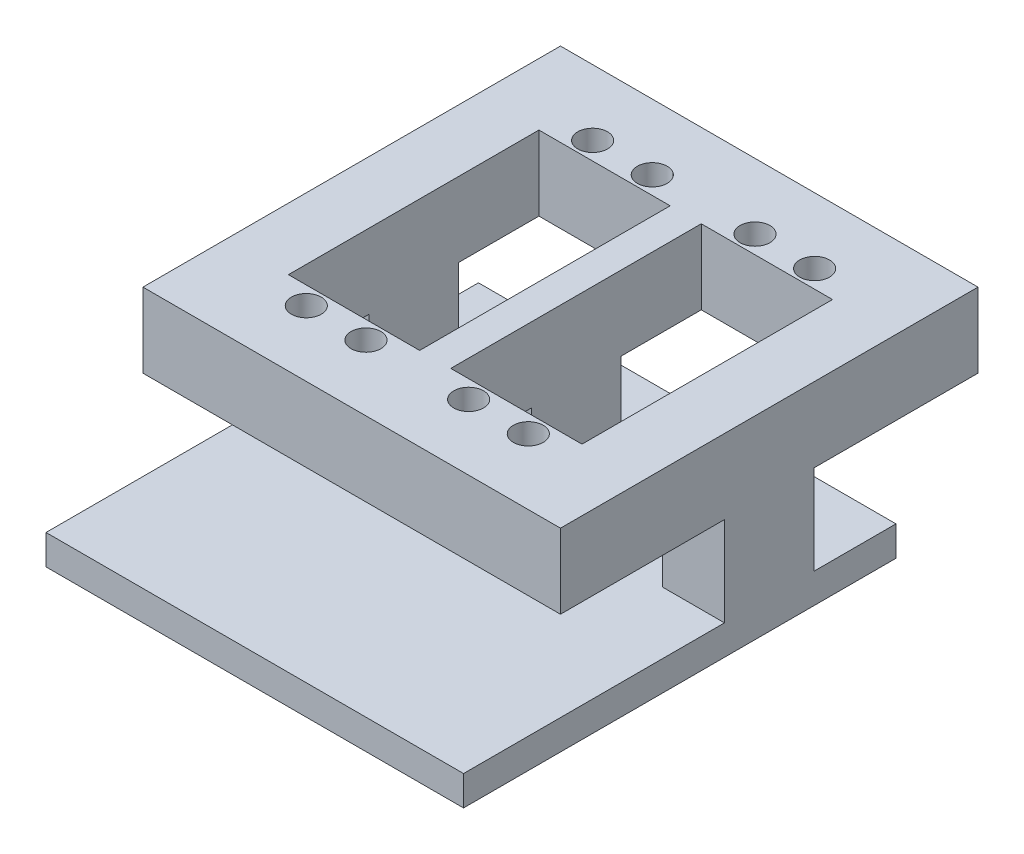
ISO-10303-21;
HEADER;
FILE_DESCRIPTION(('STEP AP214'),'2;1');
FILE_NAME('part.step','',(''),(''),'','','');
FILE_SCHEMA(('AUTOMOTIVE_DESIGN { 1 0 10303 214 1 1 1 1 }'));
ENDSEC;
DATA;
#1=APPLICATION_CONTEXT('core data for automotive mechanical design processes');
#2=APPLICATION_PROTOCOL_DEFINITION('international standard','automotive_design',2000,#1);
#3=PRODUCT_CONTEXT('',#1,'mechanical');
#4=PRODUCT('Part','Part','',(#3));
#5=PRODUCT_RELATED_PRODUCT_CATEGORY('part','',(#4));
#6=PRODUCT_DEFINITION_FORMATION('','',#4);
#7=PRODUCT_DEFINITION_CONTEXT('part definition',#1,'design');
#8=PRODUCT_DEFINITION('design','',#6,#7);
#9=PRODUCT_DEFINITION_SHAPE('','',#8);
#10=(LENGTH_UNIT() NAMED_UNIT(*) SI_UNIT(.MILLI.,.METRE.));
#11=(NAMED_UNIT(*) PLANE_ANGLE_UNIT() SI_UNIT($,.RADIAN.));
#12=(NAMED_UNIT(*) SI_UNIT($,.STERADIAN.) SOLID_ANGLE_UNIT());
#13=UNCERTAINTY_MEASURE_WITH_UNIT(LENGTH_MEASURE(1.E-05),#10,'distance_accuracy_value','');
#14=(GEOMETRIC_REPRESENTATION_CONTEXT(3) GLOBAL_UNCERTAINTY_ASSIGNED_CONTEXT((#13)) GLOBAL_UNIT_ASSIGNED_CONTEXT((#10,
#11,#12)) REPRESENTATION_CONTEXT('',''));
#15=CARTESIAN_POINT('',(0.,0.,0.));
#16=DIRECTION('',(0.,0.,1.));
#17=DIRECTION('',(1.,0.,0.));
#18=AXIS2_PLACEMENT_3D('',#15,#16,#17);
#19=CARTESIAN_POINT('',(0.,0.,0.));
#20=DIRECTION('',(0.,1.,0.));
#21=DIRECTION('',(0.,0.,1.));
#22=AXIS2_PLACEMENT_3D('',#19,#20,#21);
#23=PLANE('',#22);
#24=CARTESIAN_POINT('',(18.6085009651864,0.,-24.));
#25=DIRECTION('',(0.,1.,0.));
#26=DIRECTION('',(0.,0.,-1.));
#27=AXIS2_PLACEMENT_3D('',#24,#25,#26);
#28=CIRCLE('',#27,2.5);
#29=CARTESIAN_POINT('',(18.6085009651864,0.,-26.5));
#30=VERTEX_POINT('',#29);
#31=EDGE_CURVE('E439',#30,#30,#28,.T.);
#32=ORIENTED_EDGE('',*,*,#31,.T.);
#33=EDGE_LOOP('',(#32));
#34=FACE_BOUND('',#33,.T.);
#35=CARTESIAN_POINT('',(8.60850096518641,0.,-24.));
#36=DIRECTION('',(0.,1.,0.));
#37=DIRECTION('',(0.,0.,-1.));
#38=AXIS2_PLACEMENT_3D('',#35,#36,#37);
#39=CIRCLE('',#38,2.5);
#40=CARTESIAN_POINT('',(8.60850096518641,0.,-26.5));
#41=VERTEX_POINT('',#40);
#42=EDGE_CURVE('E444',#41,#41,#39,.T.);
#43=ORIENTED_EDGE('',*,*,#42,.T.);
#44=EDGE_LOOP('',(#43));
#45=FACE_BOUND('',#44,.T.);
#46=CARTESIAN_POINT('',(-8.60850096518641,0.,-24.));
#47=DIRECTION('',(0.,1.,0.));
#48=DIRECTION('',(0.,0.,1.));
#49=AXIS2_PLACEMENT_3D('',#46,#47,#48);
#50=CIRCLE('',#49,2.5);
#51=CARTESIAN_POINT('',(-8.60850096518641,0.,-21.5));
#52=VERTEX_POINT('',#51);
#53=EDGE_CURVE('E484',#52,#52,#50,.T.);
#54=ORIENTED_EDGE('',*,*,#53,.T.);
#55=EDGE_LOOP('',(#54));
#56=FACE_BOUND('',#55,.T.);
#57=CARTESIAN_POINT('',(-18.6085009651864,0.,-24.));
#58=DIRECTION('',(0.,1.,0.));
#59=DIRECTION('',(0.,0.,1.));
#60=AXIS2_PLACEMENT_3D('',#57,#58,#59);
#61=CIRCLE('',#60,2.5);
#62=CARTESIAN_POINT('',(-18.6085009651864,0.,-21.5));
#63=VERTEX_POINT('',#62);
#64=EDGE_CURVE('E492',#63,#63,#61,.T.);
#65=ORIENTED_EDGE('',*,*,#64,.T.);
#66=EDGE_LOOP('',(#65));
#67=FACE_BOUND('',#66,.T.);
#68=DIRECTION('',(1.,0.,0.));
#69=VECTOR('',#68,1.);
#70=CARTESIAN_POINT('',(24.6085009651864,0.,-7.50000000000028));
#71=LINE('',#70,#69);
#72=CARTESIAN_POINT('',(24.6085009651864,0.,-7.50000000000028));
#73=VERTEX_POINT('',#72);
#74=CARTESIAN_POINT('',(35.,0.,-7.50000000000028));
#75=VERTEX_POINT('',#74);
#76=EDGE_CURVE('E309',#73,#75,#71,.T.);
#77=ORIENTED_EDGE('',*,*,#76,.F.);
#78=DIRECTION('',(0.,0.,-1.));
#79=VECTOR('',#78,1.);
#80=CARTESIAN_POINT('',(24.6085009651864,0.,-21.));
#81=LINE('',#80,#79);
#82=CARTESIAN_POINT('',(24.6085009651864,0.,-21.));
#83=VERTEX_POINT('',#82);
#84=EDGE_CURVE('E395',#73,#83,#81,.T.);
#85=ORIENTED_EDGE('',*,*,#84,.T.);
#86=DIRECTION('',(-1.,0.,0.));
#87=VECTOR('',#86,1.);
#88=CARTESIAN_POINT('',(24.6085009651864,0.,-21.));
#89=LINE('',#88,#87);
#90=CARTESIAN_POINT('',(2.60850096518642,0.,-21.));
#91=VERTEX_POINT('',#90);
#92=EDGE_CURVE('E414',#83,#91,#89,.T.);
#93=ORIENTED_EDGE('',*,*,#92,.T.);
#94=DIRECTION('',(0.,0.,1.));
#95=VECTOR('',#94,1.);
#96=CARTESIAN_POINT('',(2.60850096518642,0.,-21.));
#97=LINE('',#96,#95);
#98=CARTESIAN_POINT('',(2.60850096518642,0.,-7.50000000000016));
#99=VERTEX_POINT('',#98);
#100=EDGE_CURVE('E419',#91,#99,#97,.T.);
#101=ORIENTED_EDGE('',*,*,#100,.T.);
#102=DIRECTION('',(1.,0.,0.));
#103=VECTOR('',#102,1.);
#104=CARTESIAN_POINT('',(-2.6085009651864,0.,-7.50000000000016));
#105=LINE('',#104,#103);
#106=CARTESIAN_POINT('',(-2.60850096518641,0.,-7.50000000000016));
#107=VERTEX_POINT('',#106);
#108=EDGE_CURVE('E345',#107,#99,#105,.T.);
#109=ORIENTED_EDGE('',*,*,#108,.F.);
#110=DIRECTION('',(0.,0.,-1.));
#111=VECTOR('',#110,1.);
#112=CARTESIAN_POINT('',(-2.60850096518641,0.,-21.));
#113=LINE('',#112,#111);
#114=CARTESIAN_POINT('',(-2.60850096518641,0.,-21.));
#115=VERTEX_POINT('',#114);
#116=EDGE_CURVE('E500',#107,#115,#113,.T.);
#117=ORIENTED_EDGE('',*,*,#116,.T.);
#118=DIRECTION('',(-1.,0.,0.));
#119=VECTOR('',#118,1.);
#120=CARTESIAN_POINT('',(-24.6085009651864,0.,-21.));
#121=LINE('',#120,#119);
#122=CARTESIAN_POINT('',(-24.6085009651864,0.,-21.));
#123=VERTEX_POINT('',#122);
#124=EDGE_CURVE('E522',#115,#123,#121,.T.);
#125=ORIENTED_EDGE('',*,*,#124,.T.);
#126=DIRECTION('',(0.,0.,1.));
#127=VECTOR('',#126,1.);
#128=CARTESIAN_POINT('',(-24.6085009651864,0.,-21.));
#129=LINE('',#128,#127);
#130=CARTESIAN_POINT('',(-24.6085009651864,0.,-7.50000000000028));
#131=VERTEX_POINT('',#130);
#132=EDGE_CURVE('E527',#123,#131,#129,.T.);
#133=ORIENTED_EDGE('',*,*,#132,.T.);
#134=DIRECTION('',(1.,0.,0.));
#135=VECTOR('',#134,1.);
#136=CARTESIAN_POINT('',(-35.,0.,-7.50000000000001));
#137=LINE('',#136,#135);
#138=CARTESIAN_POINT('',(-35.,0.,-7.50000000000001));
#139=VERTEX_POINT('',#138);
#140=EDGE_CURVE('E350',#139,#131,#137,.T.);
#141=ORIENTED_EDGE('',*,*,#140,.F.);
#142=DIRECTION('',(0.,0.,1.));
#143=VECTOR('',#142,1.);
#144=CARTESIAN_POINT('',(-35.,0.,-35.));
#145=LINE('',#144,#143);
#146=CARTESIAN_POINT('',(-35.,0.,-35.));
#147=VERTEX_POINT('',#146);
#148=EDGE_CURVE('E570',#147,#139,#145,.T.);
#149=ORIENTED_EDGE('',*,*,#148,.F.);
#150=DIRECTION('',(-1.,0.,0.));
#151=VECTOR('',#150,1.);
#152=CARTESIAN_POINT('',(-35.,0.,-35.));
#153=LINE('',#152,#151);
#154=CARTESIAN_POINT('',(35.,0.,-35.));
#155=VERTEX_POINT('',#154);
#156=EDGE_CURVE('E566',#155,#147,#153,.T.);
#157=ORIENTED_EDGE('',*,*,#156,.F.);
#158=DIRECTION('',(0.,0.,-1.));
#159=VECTOR('',#158,1.);
#160=CARTESIAN_POINT('',(35.,0.,-35.));
#161=LINE('',#160,#159);
#162=EDGE_CURVE('E61',#75,#155,#161,.T.);
#163=ORIENTED_EDGE('',*,*,#162,.F.);
#164=EDGE_LOOP('',(#77,#85,#93,#101,#109,#117,#125,#133,#141,#149,#157,#163));
#165=FACE_BOUND('',#164,.T.);
#166=ADVANCED_FACE('F45',(#34,#45,#56,#67,#165),#23,.F.);
#167=CARTESIAN_POINT('',(18.6085009651864,0.,24.));
#168=DIRECTION('',(0.,1.,0.));
#169=DIRECTION('',(0.,0.,1.));
#170=AXIS2_PLACEMENT_3D('',#167,#168,#169);
#171=CIRCLE('',#170,2.5);
#172=CARTESIAN_POINT('',(18.6085009651864,0.,26.5));
#173=VERTEX_POINT('',#172);
#174=EDGE_CURVE('E452',#173,#173,#171,.T.);
#175=ORIENTED_EDGE('',*,*,#174,.T.);
#176=EDGE_LOOP('',(#175));
#177=FACE_BOUND('',#176,.T.);
#178=CARTESIAN_POINT('',(8.60850096518641,0.,24.));
#179=DIRECTION('',(0.,1.,0.));
#180=DIRECTION('',(0.,0.,1.));
#181=AXIS2_PLACEMENT_3D('',#178,#179,#180);
#182=CIRCLE('',#181,2.5);
#183=CARTESIAN_POINT('',(8.60850096518641,0.,26.5));
#184=VERTEX_POINT('',#183);
#185=EDGE_CURVE('E460',#184,#184,#182,.T.);
#186=ORIENTED_EDGE('',*,*,#185,.T.);
#187=EDGE_LOOP('',(#186));
#188=FACE_BOUND('',#187,.T.);
#189=CARTESIAN_POINT('',(-18.6085009651864,0.,24.));
#190=DIRECTION('',(0.,1.,0.));
#191=DIRECTION('',(0.,0.,-1.));
#192=AXIS2_PLACEMENT_3D('',#189,#190,#191);
#193=CIRCLE('',#192,2.5);
#194=CARTESIAN_POINT('',(-18.6085009651864,0.,21.5));
#195=VERTEX_POINT('',#194);
#196=EDGE_CURVE('E468',#195,#195,#193,.T.);
#197=ORIENTED_EDGE('',*,*,#196,.T.);
#198=EDGE_LOOP('',(#197));
#199=FACE_BOUND('',#198,.T.);
#200=CARTESIAN_POINT('',(-8.60850096518641,0.,24.));
#201=DIRECTION('',(0.,1.,0.));
#202=DIRECTION('',(0.,0.,-1.));
#203=AXIS2_PLACEMENT_3D('',#200,#201,#202);
#204=CIRCLE('',#203,2.5);
#205=CARTESIAN_POINT('',(-8.60850096518641,0.,21.5));
#206=VERTEX_POINT('',#205);
#207=EDGE_CURVE('E476',#206,#206,#204,.T.);
#208=ORIENTED_EDGE('',*,*,#207,.T.);
#209=EDGE_LOOP('',(#208));
#210=FACE_BOUND('',#209,.T.);
#211=CARTESIAN_POINT('',(24.6085009651864,0.,21.));
#212=VERTEX_POINT('',#211);
#213=CARTESIAN_POINT('',(24.6085009651864,0.,7.50000000000003));
#214=VERTEX_POINT('',#213);
#215=EDGE_CURVE('E411',#212,#214,#81,.T.);
#216=ORIENTED_EDGE('',*,*,#215,.T.);
#217=DIRECTION('',(1.,0.,0.));
#218=VECTOR('',#217,1.);
#219=CARTESIAN_POINT('',(24.6085009651864,0.,7.50000000000003));
#220=LINE('',#219,#218);
#221=CARTESIAN_POINT('',(35.,0.,7.50000000000003));
#222=VERTEX_POINT('',#221);
#223=EDGE_CURVE('E69',#214,#222,#220,.T.);
#224=ORIENTED_EDGE('',*,*,#223,.T.);
#225=CARTESIAN_POINT('',(35.,0.,35.));
#226=VERTEX_POINT('',#225);
#227=EDGE_CURVE('E563',#226,#222,#161,.T.);
#228=ORIENTED_EDGE('',*,*,#227,.F.);
#229=DIRECTION('',(1.,0.,0.));
#230=VECTOR('',#229,1.);
#231=CARTESIAN_POINT('',(-35.,0.,35.));
#232=LINE('',#231,#230);
#233=CARTESIAN_POINT('',(-35.,0.,35.));
#234=VERTEX_POINT('',#233);
#235=EDGE_CURVE('E553',#234,#226,#232,.T.);
#236=ORIENTED_EDGE('',*,*,#235,.F.);
#237=CARTESIAN_POINT('',(-35.,0.,7.50000000000028));
#238=VERTEX_POINT('',#237);
#239=EDGE_CURVE('E569',#238,#234,#145,.T.);
#240=ORIENTED_EDGE('',*,*,#239,.F.);
#241=DIRECTION('',(1.,0.,0.));
#242=VECTOR('',#241,1.);
#243=CARTESIAN_POINT('',(-35.,0.,7.50000000000028));
#244=LINE('',#243,#242);
#245=CARTESIAN_POINT('',(-24.6085009651864,0.,7.50000000000028));
#246=VERTEX_POINT('',#245);
#247=EDGE_CURVE('E369',#238,#246,#244,.T.);
#248=ORIENTED_EDGE('',*,*,#247,.T.);
#249=CARTESIAN_POINT('',(-24.6085009651864,0.,21.));
#250=VERTEX_POINT('',#249);
#251=EDGE_CURVE('E526',#246,#250,#129,.T.);
#252=ORIENTED_EDGE('',*,*,#251,.T.);
#253=DIRECTION('',(1.,0.,0.));
#254=VECTOR('',#253,1.);
#255=CARTESIAN_POINT('',(-24.6085009651864,0.,21.));
#256=LINE('',#255,#254);
#257=CARTESIAN_POINT('',(-2.6085009651864,0.,21.));
#258=VERTEX_POINT('',#257);
#259=EDGE_CURVE('E508',#250,#258,#256,.T.);
#260=ORIENTED_EDGE('',*,*,#259,.T.);
#261=CARTESIAN_POINT('',(-2.6085009651864,0.,7.50000000000014));
#262=VERTEX_POINT('',#261);
#263=EDGE_CURVE('E519',#258,#262,#113,.T.);
#264=ORIENTED_EDGE('',*,*,#263,.T.);
#265=DIRECTION('',(1.,0.,0.));
#266=VECTOR('',#265,1.);
#267=CARTESIAN_POINT('',(-2.6085009651864,0.,7.50000000000015));
#268=LINE('',#267,#266);
#269=CARTESIAN_POINT('',(2.60850096518643,0.,7.50000000000015));
#270=VERTEX_POINT('',#269);
#271=EDGE_CURVE('E341',#262,#270,#268,.T.);
#272=ORIENTED_EDGE('',*,*,#271,.T.);
#273=CARTESIAN_POINT('',(2.60850096518642,0.,21.));
#274=VERTEX_POINT('',#273);
#275=EDGE_CURVE('E418',#270,#274,#97,.T.);
#276=ORIENTED_EDGE('',*,*,#275,.T.);
#277=DIRECTION('',(1.,0.,0.));
#278=VECTOR('',#277,1.);
#279=CARTESIAN_POINT('',(24.6085009651864,0.,21.));
#280=LINE('',#279,#278);
#281=EDGE_CURVE('E400',#274,#212,#280,.T.);
#282=ORIENTED_EDGE('',*,*,#281,.T.);
#283=EDGE_LOOP('',(#216,#224,#228,#236,#240,#248,#252,#260,#264,#272,#276,#282));
#284=FACE_BOUND('',#283,.T.);
#285=ADVANCED_FACE('F614',(#177,#188,#199,#210,#284),#23,.F.);
#286=CARTESIAN_POINT('',(0.,12.5,0.));
#287=DIRECTION('',(0.,1.,0.));
#288=DIRECTION('',(0.,0.,1.));
#289=AXIS2_PLACEMENT_3D('',#286,#287,#288);
#290=PLANE('',#289);
#291=CARTESIAN_POINT('',(8.60850096518641,12.5,-24.));
#292=DIRECTION('',(0.,1.,0.));
#293=DIRECTION('',(0.,0.,-1.));
#294=AXIS2_PLACEMENT_3D('',#291,#292,#293);
#295=CIRCLE('',#294,2.5);
#296=CARTESIAN_POINT('',(8.60850096518641,12.5,-26.5));
#297=VERTEX_POINT('',#296);
#298=EDGE_CURVE('E448',#297,#297,#295,.T.);
#299=ORIENTED_EDGE('',*,*,#298,.F.);
#300=EDGE_LOOP('',(#299));
#301=FACE_BOUND('',#300,.T.);
#302=CARTESIAN_POINT('',(8.60850096518641,12.5,24.));
#303=DIRECTION('',(0.,1.,0.));
#304=DIRECTION('',(0.,0.,1.));
#305=AXIS2_PLACEMENT_3D('',#302,#303,#304);
#306=CIRCLE('',#305,2.5);
#307=CARTESIAN_POINT('',(8.60850096518641,12.5,26.5));
#308=VERTEX_POINT('',#307);
#309=EDGE_CURVE('E464',#308,#308,#306,.T.);
#310=ORIENTED_EDGE('',*,*,#309,.F.);
#311=EDGE_LOOP('',(#310));
#312=FACE_BOUND('',#311,.T.);
#313=CARTESIAN_POINT('',(-8.60850096518641,12.5,24.));
#314=DIRECTION('',(0.,1.,0.));
#315=DIRECTION('',(0.,0.,-1.));
#316=AXIS2_PLACEMENT_3D('',#313,#314,#315);
#317=CIRCLE('',#316,2.5);
#318=CARTESIAN_POINT('',(-8.60850096518641,12.5,21.5));
#319=VERTEX_POINT('',#318);
#320=EDGE_CURVE('E480',#319,#319,#317,.T.);
#321=ORIENTED_EDGE('',*,*,#320,.F.);
#322=EDGE_LOOP('',(#321));
#323=FACE_BOUND('',#322,.T.);
#324=CARTESIAN_POINT('',(-18.6085009651864,12.5,-24.));
#325=DIRECTION('',(0.,1.,0.));
#326=DIRECTION('',(0.,0.,1.));
#327=AXIS2_PLACEMENT_3D('',#324,#325,#326);
#328=CIRCLE('',#327,2.5);
#329=CARTESIAN_POINT('',(-18.6085009651864,12.5,-21.5));
#330=VERTEX_POINT('',#329);
#331=EDGE_CURVE('E496',#330,#330,#328,.T.);
#332=ORIENTED_EDGE('',*,*,#331,.F.);
#333=EDGE_LOOP('',(#332));
#334=FACE_BOUND('',#333,.T.);
#335=DIRECTION('',(0.,0.,-1.));
#336=VECTOR('',#335,1.);
#337=CARTESIAN_POINT('',(35.,12.5,-35.));
#338=LINE('',#337,#336);
#339=CARTESIAN_POINT('',(35.,12.5,35.));
#340=VERTEX_POINT('',#339);
#341=CARTESIAN_POINT('',(35.,12.5,-35.));
#342=VERTEX_POINT('',#341);
#343=EDGE_CURVE('E548',#340,#342,#338,.T.);
#344=ORIENTED_EDGE('',*,*,#343,.T.);
#345=DIRECTION('',(-1.,0.,0.));
#346=VECTOR('',#345,1.);
#347=CARTESIAN_POINT('',(-35.,12.5,-35.));
#348=LINE('',#347,#346);
#349=CARTESIAN_POINT('',(-35.,12.5,-35.));
#350=VERTEX_POINT('',#349);
#351=EDGE_CURVE('E552',#342,#350,#348,.T.);
#352=ORIENTED_EDGE('',*,*,#351,.T.);
#353=DIRECTION('',(0.,0.,1.));
#354=VECTOR('',#353,1.);
#355=CARTESIAN_POINT('',(-35.,12.5,-35.));
#356=LINE('',#355,#354);
#357=CARTESIAN_POINT('',(-35.,12.5,35.));
#358=VERTEX_POINT('',#357);
#359=EDGE_CURVE('E556',#350,#358,#356,.T.);
#360=ORIENTED_EDGE('',*,*,#359,.T.);
#361=DIRECTION('',(1.,0.,0.));
#362=VECTOR('',#361,1.);
#363=CARTESIAN_POINT('',(-35.,12.5,35.));
#364=LINE('',#363,#362);
#365=EDGE_CURVE('E559',#358,#340,#364,.T.);
#366=ORIENTED_EDGE('',*,*,#365,.T.);
#367=EDGE_LOOP('',(#344,#352,#360,#366));
#368=FACE_BOUND('',#367,.T.);
#369=DIRECTION('',(-1.,0.,0.));
#370=VECTOR('',#369,1.);
#371=CARTESIAN_POINT('',(-24.6085009651864,12.5,-21.));
#372=LINE('',#371,#370);
#373=CARTESIAN_POINT('',(-2.60850096518641,12.5,-21.));
#374=VERTEX_POINT('',#373);
#375=CARTESIAN_POINT('',(-24.6085009651864,12.5,-21.));
#376=VERTEX_POINT('',#375);
#377=EDGE_CURVE('E507',#374,#376,#372,.T.);
#378=ORIENTED_EDGE('',*,*,#377,.F.);
#379=DIRECTION('',(0.,0.,-1.));
#380=VECTOR('',#379,1.);
#381=CARTESIAN_POINT('',(-2.60850096518641,12.5,-21.));
#382=LINE('',#381,#380);
#383=CARTESIAN_POINT('',(-2.6085009651864,12.5,21.));
#384=VERTEX_POINT('',#383);
#385=EDGE_CURVE('E504',#384,#374,#382,.T.);
#386=ORIENTED_EDGE('',*,*,#385,.F.);
#387=DIRECTION('',(1.,0.,0.));
#388=VECTOR('',#387,1.);
#389=CARTESIAN_POINT('',(-24.6085009651864,12.5,21.));
#390=LINE('',#389,#388);
#391=CARTESIAN_POINT('',(-24.6085009651864,12.5,21.));
#392=VERTEX_POINT('',#391);
#393=EDGE_CURVE('E515',#392,#384,#390,.T.);
#394=ORIENTED_EDGE('',*,*,#393,.F.);
#395=DIRECTION('',(0.,0.,1.));
#396=VECTOR('',#395,1.);
#397=CARTESIAN_POINT('',(-24.6085009651864,12.5,-21.));
#398=LINE('',#397,#396);
#399=EDGE_CURVE('E511',#376,#392,#398,.T.);
#400=ORIENTED_EDGE('',*,*,#399,.F.);
#401=EDGE_LOOP('',(#378,#386,#394,#400));
#402=FACE_BOUND('',#401,.T.);
#403=CARTESIAN_POINT('',(-8.60850096518641,12.5,-24.));
#404=DIRECTION('',(0.,1.,0.));
#405=DIRECTION('',(0.,0.,1.));
#406=AXIS2_PLACEMENT_3D('',#403,#404,#405);
#407=CIRCLE('',#406,2.5);
#408=CARTESIAN_POINT('',(-8.60850096518641,12.5,-21.5));
#409=VERTEX_POINT('',#408);
#410=EDGE_CURVE('E488',#409,#409,#407,.T.);
#411=ORIENTED_EDGE('',*,*,#410,.F.);
#412=EDGE_LOOP('',(#411));
#413=FACE_BOUND('',#412,.T.);
#414=CARTESIAN_POINT('',(-18.6085009651864,12.5,24.));
#415=DIRECTION('',(0.,1.,0.));
#416=DIRECTION('',(0.,0.,-1.));
#417=AXIS2_PLACEMENT_3D('',#414,#415,#416);
#418=CIRCLE('',#417,2.5);
#419=CARTESIAN_POINT('',(-18.6085009651864,12.5,21.5));
#420=VERTEX_POINT('',#419);
#421=EDGE_CURVE('E472',#420,#420,#418,.T.);
#422=ORIENTED_EDGE('',*,*,#421,.F.);
#423=EDGE_LOOP('',(#422));
#424=FACE_BOUND('',#423,.T.);
#425=CARTESIAN_POINT('',(18.6085009651864,12.5,24.));
#426=DIRECTION('',(0.,1.,0.));
#427=DIRECTION('',(0.,0.,1.));
#428=AXIS2_PLACEMENT_3D('',#425,#426,#427);
#429=CIRCLE('',#428,2.5);
#430=CARTESIAN_POINT('',(18.6085009651864,12.5,26.5));
#431=VERTEX_POINT('',#430);
#432=EDGE_CURVE('E456',#431,#431,#429,.T.);
#433=ORIENTED_EDGE('',*,*,#432,.F.);
#434=EDGE_LOOP('',(#433));
#435=FACE_BOUND('',#434,.T.);
#436=CARTESIAN_POINT('',(18.6085009651864,12.5,-24.));
#437=DIRECTION('',(0.,1.,0.));
#438=DIRECTION('',(0.,0.,-1.));
#439=AXIS2_PLACEMENT_3D('',#436,#437,#438);
#440=CIRCLE('',#439,2.5);
#441=CARTESIAN_POINT('',(18.6085009651864,12.5,-26.5));
#442=VERTEX_POINT('',#441);
#443=EDGE_CURVE('E440',#442,#442,#440,.T.);
#444=ORIENTED_EDGE('',*,*,#443,.F.);
#445=EDGE_LOOP('',(#444));
#446=FACE_BOUND('',#445,.T.);
#447=DIRECTION('',(-1.,0.,0.));
#448=VECTOR('',#447,1.);
#449=CARTESIAN_POINT('',(24.6085009651864,12.5,-21.));
#450=LINE('',#449,#448);
#451=CARTESIAN_POINT('',(24.6085009651864,12.5,-21.));
#452=VERTEX_POINT('',#451);
#453=CARTESIAN_POINT('',(2.60850096518642,12.5,-21.));
#454=VERTEX_POINT('',#453);
#455=EDGE_CURVE('E399',#452,#454,#450,.T.);
#456=ORIENTED_EDGE('',*,*,#455,.F.);
#457=DIRECTION('',(0.,0.,-1.));
#458=VECTOR('',#457,1.);
#459=CARTESIAN_POINT('',(24.6085009651864,12.5,-21.));
#460=LINE('',#459,#458);
#461=CARTESIAN_POINT('',(24.6085009651864,12.5,21.));
#462=VERTEX_POINT('',#461);
#463=EDGE_CURVE('E396',#462,#452,#460,.T.);
#464=ORIENTED_EDGE('',*,*,#463,.F.);
#465=DIRECTION('',(1.,0.,0.));
#466=VECTOR('',#465,1.);
#467=CARTESIAN_POINT('',(24.6085009651864,12.5,21.));
#468=LINE('',#467,#466);
#469=CARTESIAN_POINT('',(2.60850096518642,12.5,21.));
#470=VERTEX_POINT('',#469);
#471=EDGE_CURVE('E407',#470,#462,#468,.T.);
#472=ORIENTED_EDGE('',*,*,#471,.F.);
#473=DIRECTION('',(0.,0.,1.));
#474=VECTOR('',#473,1.);
#475=CARTESIAN_POINT('',(2.60850096518642,12.5,-21.));
#476=LINE('',#475,#474);
#477=EDGE_CURVE('E403',#454,#470,#476,.T.);
#478=ORIENTED_EDGE('',*,*,#477,.F.);
#479=EDGE_LOOP('',(#456,#464,#472,#478));
#480=FACE_BOUND('',#479,.T.);
#481=ADVANCED_FACE('F636',(#301,#312,#323,#334,#368,#402,#413,#424,#435,#446,#480),#290,.T.);
#482=CARTESIAN_POINT('',(35.,12.5,-35.));
#483=DIRECTION('',(-1.,0.,0.));
#484=DIRECTION('',(0.,0.,1.));
#485=AXIS2_PLACEMENT_3D('',#482,#483,#484);
#486=PLANE('',#485);
#487=ORIENTED_EDGE('',*,*,#227,.T.);
#488=DIRECTION('',(0.,1.,0.));
#489=VECTOR('',#488,1.);
#490=CARTESIAN_POINT('',(35.,-15.,7.49999999999999));
#491=LINE('',#490,#489);
#492=CARTESIAN_POINT('',(35.,-15.,7.49999999999999));
#493=VERTEX_POINT('',#492);
#494=EDGE_CURVE('E294',#493,#222,#491,.T.);
#495=ORIENTED_EDGE('',*,*,#494,.F.);
#496=DIRECTION('',(0.,0.,1.));
#497=VECTOR('',#496,1.);
#498=CARTESIAN_POINT('',(35.,-15.,21.2500000000001));
#499=LINE('',#498,#497);
#500=CARTESIAN_POINT('',(35.,-15.,51.2500000000001));
#501=VERTEX_POINT('',#500);
#502=EDGE_CURVE('E269',#493,#501,#499,.T.);
#503=ORIENTED_EDGE('',*,*,#502,.T.);
#504=DIRECTION('',(0.,1.,0.));
#505=VECTOR('',#504,1.);
#506=CARTESIAN_POINT('',(35.,-15.,51.2500000000001));
#507=LINE('',#506,#505);
#508=CARTESIAN_POINT('',(35.,-20.,51.2500000000001));
#509=VERTEX_POINT('',#508);
#510=EDGE_CURVE('E256',#509,#501,#507,.T.);
#511=ORIENTED_EDGE('',*,*,#510,.F.);
#512=DIRECTION('',(0.,0.,1.));
#513=VECTOR('',#512,1.);
#514=CARTESIAN_POINT('',(35.,-20.,21.2500000000001));
#515=LINE('',#514,#513);
#516=CARTESIAN_POINT('',(35.,-20.,-21.2500000000001));
#517=VERTEX_POINT('',#516);
#518=EDGE_CURVE('E246',#517,#509,#515,.T.);
#519=ORIENTED_EDGE('',*,*,#518,.F.);
#520=DIRECTION('',(0.,1.,0.));
#521=VECTOR('',#520,1.);
#522=CARTESIAN_POINT('',(35.,-20.,-21.2500000000001));
#523=LINE('',#522,#521);
#524=CARTESIAN_POINT('',(35.,-15.,-21.2500000000001));
#525=VERTEX_POINT('',#524);
#526=EDGE_CURVE('E275',#517,#525,#523,.T.);
#527=ORIENTED_EDGE('',*,*,#526,.T.);
#528=CARTESIAN_POINT('',(35.,-15.,-7.50000000000028));
#529=VERTEX_POINT('',#528);
#530=EDGE_CURVE('E276',#525,#529,#499,.T.);
#531=ORIENTED_EDGE('',*,*,#530,.T.);
#532=DIRECTION('',(0.,1.,0.));
#533=VECTOR('',#532,1.);
#534=CARTESIAN_POINT('',(35.,-15.,-7.50000000000028));
#535=LINE('',#534,#533);
#536=EDGE_CURVE('E291',#529,#75,#535,.T.);
#537=ORIENTED_EDGE('',*,*,#536,.T.);
#538=ORIENTED_EDGE('',*,*,#162,.T.);
#539=DIRECTION('',(0.,-1.,0.));
#540=VECTOR('',#539,1.);
#541=CARTESIAN_POINT('',(35.,12.5,-35.));
#542=LINE('',#541,#540);
#543=EDGE_CURVE('E11',#342,#155,#542,.T.);
#544=ORIENTED_EDGE('',*,*,#543,.F.);
#545=ORIENTED_EDGE('',*,*,#343,.F.);
#546=DIRECTION('',(0.,-1.,0.));
#547=VECTOR('',#546,1.);
#548=CARTESIAN_POINT('',(35.,12.5,35.));
#549=LINE('',#548,#547);
#550=EDGE_CURVE('E562',#340,#226,#549,.T.);
#551=ORIENTED_EDGE('',*,*,#550,.T.);
#552=EDGE_LOOP('',(#487,#495,#503,#511,#519,#527,#531,#537,#538,#544,#545,#551));
#553=FACE_BOUND('',#552,.T.);
#554=ADVANCED_FACE('F47',(#553),#486,.F.);
#555=CARTESIAN_POINT('',(-35.,12.5,-35.));
#556=DIRECTION('',(0.,0.,1.));
#557=DIRECTION('',(1.,0.,0.));
#558=AXIS2_PLACEMENT_3D('',#555,#556,#557);
#559=PLANE('',#558);
#560=ORIENTED_EDGE('',*,*,#156,.T.);
#561=DIRECTION('',(0.,-1.,0.));
#562=VECTOR('',#561,1.);
#563=CARTESIAN_POINT('',(-35.,12.5,-35.));
#564=LINE('',#563,#562);
#565=EDGE_CURVE('E54',#350,#147,#564,.T.);
#566=ORIENTED_EDGE('',*,*,#565,.F.);
#567=ORIENTED_EDGE('',*,*,#351,.F.);
#568=ORIENTED_EDGE('',*,*,#543,.T.);
#569=EDGE_LOOP('',(#560,#566,#567,#568));
#570=FACE_BOUND('',#569,.T.);
#571=ADVANCED_FACE('F698',(#570),#559,.F.);
#572=CARTESIAN_POINT('',(-35.,12.5,-35.));
#573=DIRECTION('',(1.,0.,0.));
#574=DIRECTION('',(0.,0.,-1.));
#575=AXIS2_PLACEMENT_3D('',#572,#573,#574);
#576=PLANE('',#575);
#577=ORIENTED_EDGE('',*,*,#148,.T.);
#578=DIRECTION('',(0.,1.,0.));
#579=VECTOR('',#578,1.);
#580=CARTESIAN_POINT('',(-35.,-15.,-7.50000000000001));
#581=LINE('',#580,#579);
#582=CARTESIAN_POINT('',(-35.,-15.,-7.50000000000015));
#583=VERTEX_POINT('',#582);
#584=EDGE_CURVE('E377',#583,#139,#581,.T.);
#585=ORIENTED_EDGE('',*,*,#584,.F.);
#586=DIRECTION('',(0.,0.,-1.));
#587=VECTOR('',#586,1.);
#588=CARTESIAN_POINT('',(-35.,-15.,21.2500000000001));
#589=LINE('',#588,#587);
#590=CARTESIAN_POINT('',(-35.,-15.,-21.2500000000001));
#591=VERTEX_POINT('',#590);
#592=EDGE_CURVE('E280',#583,#591,#589,.T.);
#593=ORIENTED_EDGE('',*,*,#592,.T.);
#594=DIRECTION('',(0.,1.,0.));
#595=VECTOR('',#594,1.);
#596=CARTESIAN_POINT('',(-35.,-20.,-21.2500000000001));
#597=LINE('',#596,#595);
#598=CARTESIAN_POINT('',(-35.,-20.,-21.2500000000001));
#599=VERTEX_POINT('',#598);
#600=EDGE_CURVE('E241',#599,#591,#597,.T.);
#601=ORIENTED_EDGE('',*,*,#600,.F.);
#602=DIRECTION('',(0.,0.,-1.));
#603=VECTOR('',#602,1.);
#604=CARTESIAN_POINT('',(-35.,-20.,21.2500000000001));
#605=LINE('',#604,#603);
#606=CARTESIAN_POINT('',(-35.,-20.,51.2500000000001));
#607=VERTEX_POINT('',#606);
#608=EDGE_CURVE('E233',#607,#599,#605,.T.);
#609=ORIENTED_EDGE('',*,*,#608,.F.);
#610=DIRECTION('',(0.,-1.,0.));
#611=VECTOR('',#610,1.);
#612=CARTESIAN_POINT('',(-35.,-15.,51.2500000000001));
#613=LINE('',#612,#611);
#614=CARTESIAN_POINT('',(-35.,-15.,51.2500000000001));
#615=VERTEX_POINT('',#614);
#616=EDGE_CURVE('E239',#615,#607,#613,.T.);
#617=ORIENTED_EDGE('',*,*,#616,.F.);
#618=CARTESIAN_POINT('',(-35.,-15.,7.50000000000028));
#619=VERTEX_POINT('',#618);
#620=EDGE_CURVE('E281',#615,#619,#589,.T.);
#621=ORIENTED_EDGE('',*,*,#620,.T.);
#622=DIRECTION('',(0.,1.,0.));
#623=VECTOR('',#622,1.);
#624=CARTESIAN_POINT('',(-35.,-15.,7.50000000000028));
#625=LINE('',#624,#623);
#626=EDGE_CURVE('E386',#619,#238,#625,.T.);
#627=ORIENTED_EDGE('',*,*,#626,.T.);
#628=ORIENTED_EDGE('',*,*,#239,.T.);
#629=DIRECTION('',(0.,-1.,0.));
#630=VECTOR('',#629,1.);
#631=CARTESIAN_POINT('',(-35.,12.5,35.));
#632=LINE('',#631,#630);
#633=EDGE_CURVE('E578',#358,#234,#632,.T.);
#634=ORIENTED_EDGE('',*,*,#633,.F.);
#635=ORIENTED_EDGE('',*,*,#359,.F.);
#636=ORIENTED_EDGE('',*,*,#565,.T.);
#637=EDGE_LOOP('',(#577,#585,#593,#601,#609,#617,#621,#627,#628,#634,#635,#636));
#638=FACE_BOUND('',#637,.T.);
#639=ADVANCED_FACE('F236',(#638),#576,.F.);
#640=CARTESIAN_POINT('',(-35.,12.5,35.));
#641=DIRECTION('',(0.,0.,-1.));
#642=DIRECTION('',(-1.,0.,0.));
#643=AXIS2_PLACEMENT_3D('',#640,#641,#642);
#644=PLANE('',#643);
#645=ORIENTED_EDGE('',*,*,#235,.T.);
#646=ORIENTED_EDGE('',*,*,#550,.F.);
#647=ORIENTED_EDGE('',*,*,#365,.F.);
#648=ORIENTED_EDGE('',*,*,#633,.T.);
#649=EDGE_LOOP('',(#645,#646,#647,#648));
#650=FACE_BOUND('',#649,.T.);
#651=ADVANCED_FACE('F693',(#650),#644,.F.);
#652=CARTESIAN_POINT('',(-2.60850096518641,12.5,-21.));
#653=DIRECTION('',(-1.,0.,0.));
#654=DIRECTION('',(0.,0.,1.));
#655=AXIS2_PLACEMENT_3D('',#652,#653,#654);
#656=PLANE('',#655);
#657=ORIENTED_EDGE('',*,*,#263,.F.);
#658=DIRECTION('',(0.,-1.,0.));
#659=VECTOR('',#658,1.);
#660=CARTESIAN_POINT('',(-2.6085009651864,12.5,21.));
#661=LINE('',#660,#659);
#662=EDGE_CURVE('E518',#384,#258,#661,.T.);
#663=ORIENTED_EDGE('',*,*,#662,.F.);
#664=ORIENTED_EDGE('',*,*,#385,.T.);
#665=DIRECTION('',(0.,-1.,0.));
#666=VECTOR('',#665,1.);
#667=CARTESIAN_POINT('',(-2.60850096518641,12.5,-21.));
#668=LINE('',#667,#666);
#669=EDGE_CURVE('E544',#374,#115,#668,.T.);
#670=ORIENTED_EDGE('',*,*,#669,.T.);
#671=ORIENTED_EDGE('',*,*,#116,.F.);
#672=DIRECTION('',(0.,1.,0.));
#673=VECTOR('',#672,1.);
#674=CARTESIAN_POINT('',(-2.6085009651864,-15.,-7.50000000000016));
#675=LINE('',#674,#673);
#676=CARTESIAN_POINT('',(-2.6085009651864,-15.,-7.50000000000016));
#677=VERTEX_POINT('',#676);
#678=EDGE_CURVE('E336',#677,#107,#675,.T.);
#679=ORIENTED_EDGE('',*,*,#678,.F.);
#680=DIRECTION('',(0.,0.,-1.));
#681=VECTOR('',#680,1.);
#682=CARTESIAN_POINT('',(-2.6085009651864,-15.,7.50000000000015));
#683=LINE('',#682,#681);
#684=CARTESIAN_POINT('',(-2.6085009651864,-15.,7.50000000000015));
#685=VERTEX_POINT('',#684);
#686=EDGE_CURVE('E340',#685,#677,#683,.T.);
#687=ORIENTED_EDGE('',*,*,#686,.F.);
#688=DIRECTION('',(0.,1.,0.));
#689=VECTOR('',#688,1.);
#690=CARTESIAN_POINT('',(-2.6085009651864,-15.,7.50000000000015));
#691=LINE('',#690,#689);
#692=EDGE_CURVE('E332',#685,#262,#691,.T.);
#693=ORIENTED_EDGE('',*,*,#692,.T.);
#694=EDGE_LOOP('',(#657,#663,#664,#670,#671,#679,#687,#693));
#695=FACE_BOUND('',#694,.T.);
#696=ADVANCED_FACE('F645',(#695),#656,.T.);
#697=CARTESIAN_POINT('',(-24.6085009651864,12.5,-21.));
#698=DIRECTION('',(0.,0.,1.));
#699=DIRECTION('',(1.,0.,0.));
#700=AXIS2_PLACEMENT_3D('',#697,#698,#699);
#701=PLANE('',#700);
#702=ORIENTED_EDGE('',*,*,#124,.F.);
#703=ORIENTED_EDGE('',*,*,#669,.F.);
#704=ORIENTED_EDGE('',*,*,#377,.T.);
#705=DIRECTION('',(0.,-1.,0.));
#706=VECTOR('',#705,1.);
#707=CARTESIAN_POINT('',(-24.6085009651864,12.5,-21.));
#708=LINE('',#707,#706);
#709=EDGE_CURVE('E541',#376,#123,#708,.T.);
#710=ORIENTED_EDGE('',*,*,#709,.T.);
#711=EDGE_LOOP('',(#702,#703,#704,#710));
#712=FACE_BOUND('',#711,.T.);
#713=ADVANCED_FACE('F667',(#712),#701,.T.);
#714=CARTESIAN_POINT('',(-24.6085009651864,12.5,-21.));
#715=DIRECTION('',(1.,0.,0.));
#716=DIRECTION('',(0.,0.,-1.));
#717=AXIS2_PLACEMENT_3D('',#714,#715,#716);
#718=PLANE('',#717);
#719=ORIENTED_EDGE('',*,*,#132,.F.);
#720=ORIENTED_EDGE('',*,*,#709,.F.);
#721=ORIENTED_EDGE('',*,*,#399,.T.);
#722=DIRECTION('',(0.,-1.,0.));
#723=VECTOR('',#722,1.);
#724=CARTESIAN_POINT('',(-24.6085009651864,12.5,21.));
#725=LINE('',#724,#723);
#726=EDGE_CURVE('E537',#392,#250,#725,.T.);
#727=ORIENTED_EDGE('',*,*,#726,.T.);
#728=ORIENTED_EDGE('',*,*,#251,.F.);
#729=DIRECTION('',(0.,1.,0.));
#730=VECTOR('',#729,1.);
#731=CARTESIAN_POINT('',(-24.6085009651864,-15.,7.50000000000028));
#732=LINE('',#731,#730);
#733=CARTESIAN_POINT('',(-24.6085009651864,-15.,7.50000000000028));
#734=VERTEX_POINT('',#733);
#735=EDGE_CURVE('E389',#734,#246,#732,.T.);
#736=ORIENTED_EDGE('',*,*,#735,.F.);
#737=DIRECTION('',(0.,0.,-1.));
#738=VECTOR('',#737,1.);
#739=CARTESIAN_POINT('',(-24.6085009651864,-15.,7.50000000000028));
#740=LINE('',#739,#738);
#741=CARTESIAN_POINT('',(-24.6085009651864,-15.,-7.50000000000028));
#742=VERTEX_POINT('',#741);
#743=EDGE_CURVE('E368',#734,#742,#740,.T.);
#744=ORIENTED_EDGE('',*,*,#743,.T.);
#745=DIRECTION('',(0.,1.,0.));
#746=VECTOR('',#745,1.);
#747=CARTESIAN_POINT('',(-24.6085009651864,-15.,-7.50000000000028));
#748=LINE('',#747,#746);
#749=EDGE_CURVE('E392',#742,#131,#748,.T.);
#750=ORIENTED_EDGE('',*,*,#749,.T.);
#751=EDGE_LOOP('',(#719,#720,#721,#727,#728,#736,#744,#750));
#752=FACE_BOUND('',#751,.T.);
#753=ADVANCED_FACE('F669',(#752),#718,.T.);
#754=CARTESIAN_POINT('',(-24.6085009651864,12.5,21.));
#755=DIRECTION('',(0.,0.,-1.));
#756=DIRECTION('',(-1.,0.,0.));
#757=AXIS2_PLACEMENT_3D('',#754,#755,#756);
#758=PLANE('',#757);
#759=ORIENTED_EDGE('',*,*,#259,.F.);
#760=ORIENTED_EDGE('',*,*,#726,.F.);
#761=ORIENTED_EDGE('',*,*,#393,.T.);
#762=ORIENTED_EDGE('',*,*,#662,.T.);
#763=EDGE_LOOP('',(#759,#760,#761,#762));
#764=FACE_BOUND('',#763,.T.);
#765=ADVANCED_FACE('F658',(#764),#758,.T.);
#766=CARTESIAN_POINT('',(-18.6085009651864,12.5,-24.));
#767=DIRECTION('',(0.,-1.,0.));
#768=DIRECTION('',(0.,0.,-1.));
#769=AXIS2_PLACEMENT_3D('',#766,#767,#768);
#770=CYLINDRICAL_SURFACE('',#769,2.5);
#771=ORIENTED_EDGE('',*,*,#331,.T.);
#772=EDGE_LOOP('',(#771));
#773=FACE_BOUND('',#772,.T.);
#774=ORIENTED_EDGE('',*,*,#64,.F.);
#775=EDGE_LOOP('',(#774));
#776=FACE_BOUND('',#775,.T.);
#777=ADVANCED_FACE('F677',(#773,#776),#770,.F.);
#778=CARTESIAN_POINT('',(-8.60850096518641,12.5,-24.));
#779=DIRECTION('',(0.,-1.,0.));
#780=DIRECTION('',(0.,0.,-1.));
#781=AXIS2_PLACEMENT_3D('',#778,#779,#780);
#782=CYLINDRICAL_SURFACE('',#781,2.5);
#783=ORIENTED_EDGE('',*,*,#410,.T.);
#784=EDGE_LOOP('',(#783));
#785=FACE_BOUND('',#784,.T.);
#786=ORIENTED_EDGE('',*,*,#53,.F.);
#787=EDGE_LOOP('',(#786));
#788=FACE_BOUND('',#787,.T.);
#789=ADVANCED_FACE('F722',(#785,#788),#782,.F.);
#790=CARTESIAN_POINT('',(-8.60850096518641,12.5,24.));
#791=DIRECTION('',(0.,-1.,0.));
#792=DIRECTION('',(0.,0.,-1.));
#793=AXIS2_PLACEMENT_3D('',#790,#791,#792);
#794=CYLINDRICAL_SURFACE('',#793,2.5);
#795=ORIENTED_EDGE('',*,*,#320,.T.);
#796=EDGE_LOOP('',(#795));
#797=FACE_BOUND('',#796,.T.);
#798=ORIENTED_EDGE('',*,*,#207,.F.);
#799=EDGE_LOOP('',(#798));
#800=FACE_BOUND('',#799,.T.);
#801=ADVANCED_FACE('F729',(#797,#800),#794,.F.);
#802=CARTESIAN_POINT('',(-18.6085009651864,12.5,24.));
#803=DIRECTION('',(0.,-1.,0.));
#804=DIRECTION('',(0.,0.,-1.));
#805=AXIS2_PLACEMENT_3D('',#802,#803,#804);
#806=CYLINDRICAL_SURFACE('',#805,2.5);
#807=ORIENTED_EDGE('',*,*,#421,.T.);
#808=EDGE_LOOP('',(#807));
#809=FACE_BOUND('',#808,.T.);
#810=ORIENTED_EDGE('',*,*,#196,.F.);
#811=EDGE_LOOP('',(#810));
#812=FACE_BOUND('',#811,.T.);
#813=ADVANCED_FACE('F735',(#809,#812),#806,.F.);
#814=CARTESIAN_POINT('',(8.60850096518641,12.5,24.));
#815=DIRECTION('',(0.,-1.,0.));
#816=DIRECTION('',(0.,0.,-1.));
#817=AXIS2_PLACEMENT_3D('',#814,#815,#816);
#818=CYLINDRICAL_SURFACE('',#817,2.5);
#819=ORIENTED_EDGE('',*,*,#309,.T.);
#820=EDGE_LOOP('',(#819));
#821=FACE_BOUND('',#820,.T.);
#822=ORIENTED_EDGE('',*,*,#185,.F.);
#823=EDGE_LOOP('',(#822));
#824=FACE_BOUND('',#823,.T.);
#825=ADVANCED_FACE('F739',(#821,#824),#818,.F.);
#826=CARTESIAN_POINT('',(18.6085009651864,12.5,24.));
#827=DIRECTION('',(0.,-1.,0.));
#828=DIRECTION('',(0.,0.,-1.));
#829=AXIS2_PLACEMENT_3D('',#826,#827,#828);
#830=CYLINDRICAL_SURFACE('',#829,2.5);
#831=ORIENTED_EDGE('',*,*,#432,.T.);
#832=EDGE_LOOP('',(#831));
#833=FACE_BOUND('',#832,.T.);
#834=ORIENTED_EDGE('',*,*,#174,.F.);
#835=EDGE_LOOP('',(#834));
#836=FACE_BOUND('',#835,.T.);
#837=ADVANCED_FACE('F743',(#833,#836),#830,.F.);
#838=CARTESIAN_POINT('',(8.60850096518641,12.5,-24.));
#839=DIRECTION('',(0.,-1.,0.));
#840=DIRECTION('',(0.,0.,-1.));
#841=AXIS2_PLACEMENT_3D('',#838,#839,#840);
#842=CYLINDRICAL_SURFACE('',#841,2.5);
#843=ORIENTED_EDGE('',*,*,#298,.T.);
#844=EDGE_LOOP('',(#843));
#845=FACE_BOUND('',#844,.T.);
#846=ORIENTED_EDGE('',*,*,#42,.F.);
#847=EDGE_LOOP('',(#846));
#848=FACE_BOUND('',#847,.T.);
#849=ADVANCED_FACE('F747',(#845,#848),#842,.F.);
#850=CARTESIAN_POINT('',(18.6085009651864,12.5,-24.));
#851=DIRECTION('',(0.,-1.,0.));
#852=DIRECTION('',(0.,0.,-1.));
#853=AXIS2_PLACEMENT_3D('',#850,#851,#852);
#854=CYLINDRICAL_SURFACE('',#853,2.5);
#855=ORIENTED_EDGE('',*,*,#443,.T.);
#856=EDGE_LOOP('',(#855));
#857=FACE_BOUND('',#856,.T.);
#858=ORIENTED_EDGE('',*,*,#31,.F.);
#859=EDGE_LOOP('',(#858));
#860=FACE_BOUND('',#859,.T.);
#861=ADVANCED_FACE('F751',(#857,#860),#854,.F.);
#862=CARTESIAN_POINT('',(24.6085009651864,12.5,-21.));
#863=DIRECTION('',(-1.,0.,0.));
#864=DIRECTION('',(0.,0.,1.));
#865=AXIS2_PLACEMENT_3D('',#862,#863,#864);
#866=PLANE('',#865);
#867=ORIENTED_EDGE('',*,*,#215,.F.);
#868=DIRECTION('',(0.,-1.,0.));
#869=VECTOR('',#868,1.);
#870=CARTESIAN_POINT('',(24.6085009651864,12.5,21.));
#871=LINE('',#870,#869);
#872=EDGE_CURVE('E410',#462,#212,#871,.T.);
#873=ORIENTED_EDGE('',*,*,#872,.F.);
#874=ORIENTED_EDGE('',*,*,#463,.T.);
#875=DIRECTION('',(0.,-1.,0.));
#876=VECTOR('',#875,1.);
#877=CARTESIAN_POINT('',(24.6085009651864,12.5,-21.));
#878=LINE('',#877,#876);
#879=EDGE_CURVE('E435',#452,#83,#878,.T.);
#880=ORIENTED_EDGE('',*,*,#879,.T.);
#881=ORIENTED_EDGE('',*,*,#84,.F.);
#882=DIRECTION('',(0.,1.,0.));
#883=VECTOR('',#882,1.);
#884=CARTESIAN_POINT('',(24.6085009651864,-15.,-7.50000000000028));
#885=LINE('',#884,#883);
#886=CARTESIAN_POINT('',(24.6085009651864,-15.,-7.50000000000028));
#887=VERTEX_POINT('',#886);
#888=EDGE_CURVE('E302',#887,#73,#885,.T.);
#889=ORIENTED_EDGE('',*,*,#888,.F.);
#890=DIRECTION('',(0.,0.,-1.));
#891=VECTOR('',#890,1.);
#892=CARTESIAN_POINT('',(24.6085009651864,-15.,7.50000000000003));
#893=LINE('',#892,#891);
#894=CARTESIAN_POINT('',(24.6085009651864,-15.,7.50000000000003));
#895=VERTEX_POINT('',#894);
#896=EDGE_CURVE('E306',#895,#887,#893,.T.);
#897=ORIENTED_EDGE('',*,*,#896,.F.);
#898=DIRECTION('',(0.,1.,0.));
#899=VECTOR('',#898,1.);
#900=CARTESIAN_POINT('',(24.6085009651864,-15.,7.50000000000003));
#901=LINE('',#900,#899);
#902=EDGE_CURVE('E298',#895,#214,#901,.T.);
#903=ORIENTED_EDGE('',*,*,#902,.T.);
#904=EDGE_LOOP('',(#867,#873,#874,#880,#881,#889,#897,#903));
#905=FACE_BOUND('',#904,.T.);
#906=ADVANCED_FACE('F631',(#905),#866,.T.);
#907=CARTESIAN_POINT('',(24.6085009651864,12.5,-21.));
#908=DIRECTION('',(0.,0.,1.));
#909=DIRECTION('',(1.,0.,0.));
#910=AXIS2_PLACEMENT_3D('',#907,#908,#909);
#911=PLANE('',#910);
#912=ORIENTED_EDGE('',*,*,#92,.F.);
#913=ORIENTED_EDGE('',*,*,#879,.F.);
#914=ORIENTED_EDGE('',*,*,#455,.T.);
#915=DIRECTION('',(0.,-1.,0.));
#916=VECTOR('',#915,1.);
#917=CARTESIAN_POINT('',(2.60850096518642,12.5,-21.));
#918=LINE('',#917,#916);
#919=EDGE_CURVE('E432',#454,#91,#918,.T.);
#920=ORIENTED_EDGE('',*,*,#919,.T.);
#921=EDGE_LOOP('',(#912,#913,#914,#920));
#922=FACE_BOUND('',#921,.T.);
#923=ADVANCED_FACE('F627',(#922),#911,.T.);
#924=CARTESIAN_POINT('',(2.60850096518642,12.5,-21.));
#925=DIRECTION('',(1.,0.,0.));
#926=DIRECTION('',(0.,0.,-1.));
#927=AXIS2_PLACEMENT_3D('',#924,#925,#926);
#928=PLANE('',#927);
#929=ORIENTED_EDGE('',*,*,#100,.F.);
#930=ORIENTED_EDGE('',*,*,#919,.F.);
#931=ORIENTED_EDGE('',*,*,#477,.T.);
#932=DIRECTION('',(0.,-1.,0.));
#933=VECTOR('',#932,1.);
#934=CARTESIAN_POINT('',(2.60850096518642,12.5,21.));
#935=LINE('',#934,#933);
#936=EDGE_CURVE('E428',#470,#274,#935,.T.);
#937=ORIENTED_EDGE('',*,*,#936,.T.);
#938=ORIENTED_EDGE('',*,*,#275,.F.);
#939=DIRECTION('',(0.,1.,0.));
#940=VECTOR('',#939,1.);
#941=CARTESIAN_POINT('',(2.60850096518643,-15.,7.50000000000015));
#942=LINE('',#941,#940);
#943=CARTESIAN_POINT('',(2.60850096518643,-15.,7.50000000000015));
#944=VERTEX_POINT('',#943);
#945=EDGE_CURVE('E328',#944,#270,#942,.T.);
#946=ORIENTED_EDGE('',*,*,#945,.F.);
#947=DIRECTION('',(0.,0.,-1.));
#948=VECTOR('',#947,1.);
#949=CARTESIAN_POINT('',(2.60850096518643,-15.,7.50000000000015));
#950=LINE('',#949,#948);
#951=CARTESIAN_POINT('',(2.60850096518643,-15.,-7.50000000000016));
#952=VERTEX_POINT('',#951);
#953=EDGE_CURVE('E358',#944,#952,#950,.T.);
#954=ORIENTED_EDGE('',*,*,#953,.T.);
#955=DIRECTION('',(0.,1.,0.));
#956=VECTOR('',#955,1.);
#957=CARTESIAN_POINT('',(2.60850096518643,-15.,-7.50000000000016));
#958=LINE('',#957,#956);
#959=EDGE_CURVE('E314',#952,#99,#958,.T.);
#960=ORIENTED_EDGE('',*,*,#959,.T.);
#961=EDGE_LOOP('',(#929,#930,#931,#937,#938,#946,#954,#960));
#962=FACE_BOUND('',#961,.T.);
#963=ADVANCED_FACE('F639',(#962),#928,.T.);
#964=CARTESIAN_POINT('',(24.6085009651864,12.5,21.));
#965=DIRECTION('',(0.,0.,-1.));
#966=DIRECTION('',(-1.,0.,0.));
#967=AXIS2_PLACEMENT_3D('',#964,#965,#966);
#968=PLANE('',#967);
#969=ORIENTED_EDGE('',*,*,#281,.F.);
#970=ORIENTED_EDGE('',*,*,#936,.F.);
#971=ORIENTED_EDGE('',*,*,#471,.T.);
#972=ORIENTED_EDGE('',*,*,#872,.T.);
#973=EDGE_LOOP('',(#969,#970,#971,#972));
#974=FACE_BOUND('',#973,.T.);
#975=ADVANCED_FACE('F761',(#974),#968,.T.);
#976=CARTESIAN_POINT('',(-35.,-15.,-7.50000000000001));
#977=DIRECTION('',(0.,0.,1.));
#978=DIRECTION('',(1.,0.,0.));
#979=AXIS2_PLACEMENT_3D('',#976,#977,#978);
#980=PLANE('',#979);
#981=ORIENTED_EDGE('',*,*,#140,.T.);
#982=ORIENTED_EDGE('',*,*,#749,.F.);
#983=DIRECTION('',(1.,0.,0.));
#984=VECTOR('',#983,1.);
#985=CARTESIAN_POINT('',(-35.,-15.,-7.50000000000001));
#986=LINE('',#985,#984);
#987=EDGE_CURVE('E365',#583,#742,#986,.T.);
#988=ORIENTED_EDGE('',*,*,#987,.F.);
#989=ORIENTED_EDGE('',*,*,#584,.T.);
#990=EDGE_LOOP('',(#981,#982,#988,#989));
#991=FACE_BOUND('',#990,.T.);
#992=ADVANCED_FACE('F593',(#991),#980,.F.);
#993=CARTESIAN_POINT('',(-35.,-15.,7.50000000000028));
#994=DIRECTION('',(0.,0.,1.));
#995=DIRECTION('',(1.,0.,0.));
#996=AXIS2_PLACEMENT_3D('',#993,#994,#995);
#997=PLANE('',#996);
#998=ORIENTED_EDGE('',*,*,#247,.F.);
#999=ORIENTED_EDGE('',*,*,#626,.F.);
#1000=DIRECTION('',(1.,0.,0.));
#1001=VECTOR('',#1000,1.);
#1002=CARTESIAN_POINT('',(-35.,-15.,7.50000000000028));
#1003=LINE('',#1002,#1001);
#1004=EDGE_CURVE('E373',#619,#734,#1003,.T.);
#1005=ORIENTED_EDGE('',*,*,#1004,.T.);
#1006=ORIENTED_EDGE('',*,*,#735,.T.);
#1007=EDGE_LOOP('',(#998,#999,#1005,#1006));
#1008=FACE_BOUND('',#1007,.T.);
#1009=ADVANCED_FACE('F609',(#1008),#997,.T.);
#1010=CARTESIAN_POINT('',(-2.6085009651864,-15.,-7.50000000000016));
#1011=DIRECTION('',(0.,0.,1.));
#1012=DIRECTION('',(1.,0.,0.));
#1013=AXIS2_PLACEMENT_3D('',#1010,#1011,#1012);
#1014=PLANE('',#1013);
#1015=ORIENTED_EDGE('',*,*,#108,.T.);
#1016=ORIENTED_EDGE('',*,*,#959,.F.);
#1017=DIRECTION('',(1.,0.,0.));
#1018=VECTOR('',#1017,1.);
#1019=CARTESIAN_POINT('',(-2.6085009651864,-15.,-7.50000000000016));
#1020=LINE('',#1019,#1018);
#1021=EDGE_CURVE('E346',#677,#952,#1020,.T.);
#1022=ORIENTED_EDGE('',*,*,#1021,.F.);
#1023=ORIENTED_EDGE('',*,*,#678,.T.);
#1024=EDGE_LOOP('',(#1015,#1016,#1022,#1023));
#1025=FACE_BOUND('',#1024,.T.);
#1026=ADVANCED_FACE('F648',(#1025),#1014,.F.);
#1027=CARTESIAN_POINT('',(-2.6085009651864,-15.,7.50000000000015));
#1028=DIRECTION('',(0.,0.,1.));
#1029=DIRECTION('',(1.,0.,0.));
#1030=AXIS2_PLACEMENT_3D('',#1027,#1028,#1029);
#1031=PLANE('',#1030);
#1032=ORIENTED_EDGE('',*,*,#271,.F.);
#1033=ORIENTED_EDGE('',*,*,#692,.F.);
#1034=DIRECTION('',(1.,0.,0.));
#1035=VECTOR('',#1034,1.);
#1036=CARTESIAN_POINT('',(-2.6085009651864,-15.,7.50000000000015));
#1037=LINE('',#1036,#1035);
#1038=EDGE_CURVE('E354',#685,#944,#1037,.T.);
#1039=ORIENTED_EDGE('',*,*,#1038,.T.);
#1040=ORIENTED_EDGE('',*,*,#945,.T.);
#1041=EDGE_LOOP('',(#1032,#1033,#1039,#1040));
#1042=FACE_BOUND('',#1041,.T.);
#1043=ADVANCED_FACE('F655',(#1042),#1031,.T.);
#1044=CARTESIAN_POINT('',(24.6085009651864,-15.,-7.50000000000028));
#1045=DIRECTION('',(0.,0.,1.));
#1046=DIRECTION('',(1.,0.,0.));
#1047=AXIS2_PLACEMENT_3D('',#1044,#1045,#1046);
#1048=PLANE('',#1047);
#1049=ORIENTED_EDGE('',*,*,#76,.T.);
#1050=ORIENTED_EDGE('',*,*,#536,.F.);
#1051=DIRECTION('',(1.,0.,0.));
#1052=VECTOR('',#1051,1.);
#1053=CARTESIAN_POINT('',(24.6085009651864,-15.,-7.50000000000028));
#1054=LINE('',#1053,#1052);
#1055=EDGE_CURVE('E310',#887,#529,#1054,.T.);
#1056=ORIENTED_EDGE('',*,*,#1055,.F.);
#1057=ORIENTED_EDGE('',*,*,#888,.T.);
#1058=EDGE_LOOP('',(#1049,#1050,#1056,#1057));
#1059=FACE_BOUND('',#1058,.T.);
#1060=ADVANCED_FACE('F770',(#1059),#1048,.F.);
#1061=CARTESIAN_POINT('',(24.6085009651864,-15.,7.50000000000003));
#1062=DIRECTION('',(0.,0.,1.));
#1063=DIRECTION('',(1.,0.,0.));
#1064=AXIS2_PLACEMENT_3D('',#1061,#1062,#1063);
#1065=PLANE('',#1064);
#1066=ORIENTED_EDGE('',*,*,#223,.F.);
#1067=ORIENTED_EDGE('',*,*,#902,.F.);
#1068=DIRECTION('',(1.,0.,0.));
#1069=VECTOR('',#1068,1.);
#1070=CARTESIAN_POINT('',(24.6085009651864,-15.,7.50000000000003));
#1071=LINE('',#1070,#1069);
#1072=EDGE_CURVE('E318',#895,#493,#1071,.T.);
#1073=ORIENTED_EDGE('',*,*,#1072,.T.);
#1074=ORIENTED_EDGE('',*,*,#494,.T.);
#1075=EDGE_LOOP('',(#1066,#1067,#1073,#1074));
#1076=FACE_BOUND('',#1075,.T.);
#1077=ADVANCED_FACE('F773',(#1076),#1065,.T.);
#1078=CARTESIAN_POINT('',(0.,-15.,0.));
#1079=DIRECTION('',(0.,-1.,0.));
#1080=DIRECTION('',(0.,0.,-1.));
#1081=AXIS2_PLACEMENT_3D('',#1078,#1079,#1080);
#1082=PLANE('',#1081);
#1083=ORIENTED_EDGE('',*,*,#686,.T.);
#1084=ORIENTED_EDGE('',*,*,#1021,.T.);
#1085=ORIENTED_EDGE('',*,*,#953,.F.);
#1086=ORIENTED_EDGE('',*,*,#1038,.F.);
#1087=EDGE_LOOP('',(#1083,#1084,#1085,#1086));
#1088=FACE_BOUND('',#1087,.T.);
#1089=ORIENTED_EDGE('',*,*,#592,.F.);
#1090=ORIENTED_EDGE('',*,*,#987,.T.);
#1091=ORIENTED_EDGE('',*,*,#743,.F.);
#1092=ORIENTED_EDGE('',*,*,#1004,.F.);
#1093=ORIENTED_EDGE('',*,*,#620,.F.);
#1094=DIRECTION('',(-1.,0.,0.));
#1095=VECTOR('',#1094,1.);
#1096=CARTESIAN_POINT('',(-35.,-15.,51.2500000000001));
#1097=LINE('',#1096,#1095);
#1098=EDGE_CURVE('E261',#501,#615,#1097,.T.);
#1099=ORIENTED_EDGE('',*,*,#1098,.F.);
#1100=ORIENTED_EDGE('',*,*,#502,.F.);
#1101=ORIENTED_EDGE('',*,*,#1072,.F.);
#1102=ORIENTED_EDGE('',*,*,#896,.T.);
#1103=ORIENTED_EDGE('',*,*,#1055,.T.);
#1104=ORIENTED_EDGE('',*,*,#530,.F.);
#1105=DIRECTION('',(1.,0.,0.));
#1106=VECTOR('',#1105,1.);
#1107=CARTESIAN_POINT('',(-35.,-15.,-21.2500000000001));
#1108=LINE('',#1107,#1106);
#1109=EDGE_CURVE('E271',#591,#525,#1108,.T.);
#1110=ORIENTED_EDGE('',*,*,#1109,.F.);
#1111=EDGE_LOOP('',(#1089,#1090,#1091,#1092,#1093,#1099,#1100,#1101,#1102,#1103,#1104,#1110));
#1112=FACE_BOUND('',#1111,.T.);
#1113=ADVANCED_FACE('F602',(#1088,#1112),#1082,.F.);
#1114=CARTESIAN_POINT('',(-35.,-20.,-21.2500000000001));
#1115=DIRECTION('',(0.,0.,1.));
#1116=DIRECTION('',(1.,0.,0.));
#1117=AXIS2_PLACEMENT_3D('',#1114,#1115,#1116);
#1118=PLANE('',#1117);
#1119=ORIENTED_EDGE('',*,*,#1109,.T.);
#1120=ORIENTED_EDGE('',*,*,#526,.F.);
#1121=DIRECTION('',(1.,0.,0.));
#1122=VECTOR('',#1121,1.);
#1123=CARTESIAN_POINT('',(-35.,-20.,-21.2500000000001));
#1124=LINE('',#1123,#1122);
#1125=EDGE_CURVE('E245',#599,#517,#1124,.T.);
#1126=ORIENTED_EDGE('',*,*,#1125,.F.);
#1127=ORIENTED_EDGE('',*,*,#600,.T.);
#1128=EDGE_LOOP('',(#1119,#1120,#1126,#1127));
#1129=FACE_BOUND('',#1128,.T.);
#1130=ADVANCED_FACE('F599',(#1129),#1118,.F.);
#1131=CARTESIAN_POINT('',(0.,-20.,0.));
#1132=DIRECTION('',(0.,-1.,0.));
#1133=DIRECTION('',(0.,0.,-1.));
#1134=AXIS2_PLACEMENT_3D('',#1131,#1132,#1133);
#1135=PLANE('',#1134);
#1136=ORIENTED_EDGE('',*,*,#518,.T.);
#1137=DIRECTION('',(1.,0.,0.));
#1138=VECTOR('',#1137,1.);
#1139=CARTESIAN_POINT('',(-35.,-20.,51.2500000000001));
#1140=LINE('',#1139,#1138);
#1141=EDGE_CURVE('E249',#607,#509,#1140,.T.);
#1142=ORIENTED_EDGE('',*,*,#1141,.F.);
#1143=ORIENTED_EDGE('',*,*,#608,.T.);
#1144=ORIENTED_EDGE('',*,*,#1125,.T.);
#1145=EDGE_LOOP('',(#1136,#1142,#1143,#1144));
#1146=FACE_BOUND('',#1145,.T.);
#1147=ADVANCED_FACE('F250',(#1146),#1135,.T.);
#1148=CARTESIAN_POINT('',(0.,0.,51.2500000000001));
#1149=DIRECTION('',(0.,0.,1.));
#1150=DIRECTION('',(1.,0.,0.));
#1151=AXIS2_PLACEMENT_3D('',#1148,#1149,#1150);
#1152=PLANE('',#1151);
#1153=ORIENTED_EDGE('',*,*,#616,.T.);
#1154=ORIENTED_EDGE('',*,*,#1141,.T.);
#1155=ORIENTED_EDGE('',*,*,#510,.T.);
#1156=ORIENTED_EDGE('',*,*,#1098,.T.);
#1157=EDGE_LOOP('',(#1153,#1154,#1155,#1156));
#1158=FACE_BOUND('',#1157,.T.);
#1159=ADVANCED_FACE('F259',(#1158),#1152,.T.);
#1160=CLOSED_SHELL('',(#166,#285,#481,#554,#571,#639,#651,#696,#713,#753,#765,#777,#789,#801,
#813,#825,#837,#849,#861,#906,#923,#963,#975,#992,#1009,#1026,#1043,#1060,#1077,#1113,#1130,
#1147,#1159));
#1161=MANIFOLD_SOLID_BREP('B2',#1160);
#1162=ADVANCED_BREP_SHAPE_REPRESENTATION('',(#18,#1161),#14);
#1163=SHAPE_DEFINITION_REPRESENTATION(#9,#1162);
ENDSEC;
END-ISO-10303-21;
